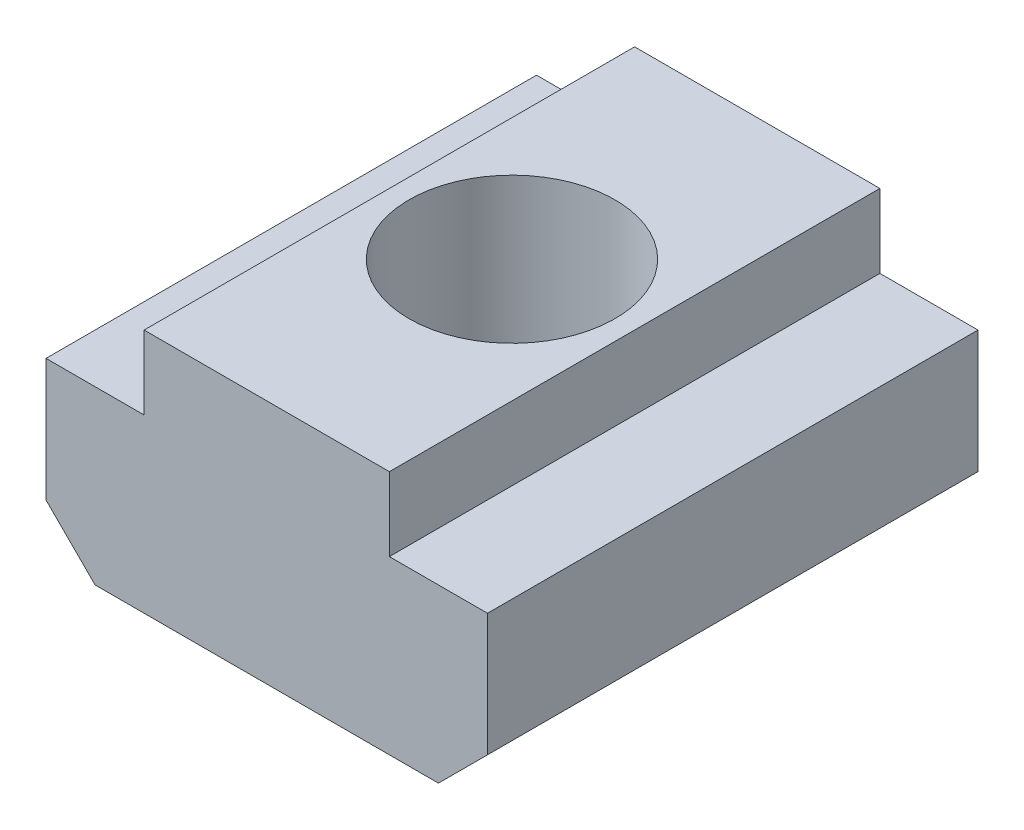
ISO-10303-21;
HEADER;
FILE_DESCRIPTION(('STEP AP214'),'2;1');
FILE_NAME('part.step','',(''),(''),'','','');
FILE_SCHEMA(('AUTOMOTIVE_DESIGN { 1 0 10303 214 1 1 1 1 }'));
ENDSEC;
DATA;
#1=APPLICATION_CONTEXT('core data for automotive mechanical design processes');
#2=APPLICATION_PROTOCOL_DEFINITION('international standard','automotive_design',2000,#1);
#3=PRODUCT_CONTEXT('',#1,'mechanical');
#4=PRODUCT('Part','Part','',(#3));
#5=PRODUCT_RELATED_PRODUCT_CATEGORY('part','',(#4));
#6=PRODUCT_DEFINITION_FORMATION('','',#4);
#7=PRODUCT_DEFINITION_CONTEXT('part definition',#1,'design');
#8=PRODUCT_DEFINITION('design','',#6,#7);
#9=PRODUCT_DEFINITION_SHAPE('','',#8);
#10=(LENGTH_UNIT() NAMED_UNIT(*) SI_UNIT(.MILLI.,.METRE.));
#11=(NAMED_UNIT(*) PLANE_ANGLE_UNIT() SI_UNIT($,.RADIAN.));
#12=(NAMED_UNIT(*) SI_UNIT($,.STERADIAN.) SOLID_ANGLE_UNIT());
#13=UNCERTAINTY_MEASURE_WITH_UNIT(LENGTH_MEASURE(1.E-05),#10,'distance_accuracy_value','');
#14=(GEOMETRIC_REPRESENTATION_CONTEXT(3) GLOBAL_UNCERTAINTY_ASSIGNED_CONTEXT((#13)) GLOBAL_UNIT_ASSIGNED_CONTEXT((#10,
#11,#12)) REPRESENTATION_CONTEXT('',''));
#15=CARTESIAN_POINT('',(0.,0.,0.));
#16=DIRECTION('',(0.,0.,1.));
#17=DIRECTION('',(1.,0.,0.));
#18=AXIS2_PLACEMENT_3D('',#15,#16,#17);
#19=CARTESIAN_POINT('',(-4.5,1.,10.));
#20=DIRECTION('',(0.707106781186548,0.707106781186548,0.));
#21=DIRECTION('',(-0.707106781186548,0.707106781186548,0.));
#22=AXIS2_PLACEMENT_3D('',#19,#20,#21);
#23=PLANE('',#22);
#24=DIRECTION('',(0.707106781186548,-0.707106781186548,0.));
#25=VECTOR('',#24,1.);
#26=CARTESIAN_POINT('',(-4.5,1.,0.));
#27=LINE('',#26,#25);
#28=CARTESIAN_POINT('',(-4.5,1.,0.));
#29=VERTEX_POINT('',#28);
#30=CARTESIAN_POINT('',(-3.5,0.,0.));
#31=VERTEX_POINT('',#30);
#32=EDGE_CURVE('E145',#29,#31,#27,.T.);
#33=ORIENTED_EDGE('',*,*,#32,.T.);
#34=DIRECTION('',(0.,0.,-1.));
#35=VECTOR('',#34,1.);
#36=CARTESIAN_POINT('',(-3.5,0.,10.));
#37=LINE('',#36,#35);
#38=CARTESIAN_POINT('',(-3.5,0.,10.));
#39=VERTEX_POINT('',#38);
#40=EDGE_CURVE('E11',#39,#31,#37,.T.);
#41=ORIENTED_EDGE('',*,*,#40,.F.);
#42=DIRECTION('',(0.707106781186548,-0.707106781186548,0.));
#43=VECTOR('',#42,1.);
#44=CARTESIAN_POINT('',(-4.5,1.,10.));
#45=LINE('',#44,#43);
#46=CARTESIAN_POINT('',(-4.5,1.,10.));
#47=VERTEX_POINT('',#46);
#48=EDGE_CURVE('E164',#47,#39,#45,.T.);
#49=ORIENTED_EDGE('',*,*,#48,.F.);
#50=DIRECTION('',(0.,0.,-1.));
#51=VECTOR('',#50,1.);
#52=CARTESIAN_POINT('',(-4.5,1.,10.));
#53=LINE('',#52,#51);
#54=EDGE_CURVE('E141',#47,#29,#53,.T.);
#55=ORIENTED_EDGE('',*,*,#54,.T.);
#56=EDGE_LOOP('',(#33,#41,#49,#55));
#57=FACE_BOUND('',#56,.T.);
#58=ADVANCED_FACE('F37',(#57),#23,.F.);
#59=CARTESIAN_POINT('',(-3.5,0.,10.));
#60=DIRECTION('',(0.,1.,0.));
#61=DIRECTION('',(0.,0.,1.));
#62=AXIS2_PLACEMENT_3D('',#59,#60,#61);
#63=PLANE('',#62);
#64=CARTESIAN_POINT('',(0.,0.,5.));
#65=DIRECTION('',(0.,1.,0.));
#66=DIRECTION('',(0.,0.,1.));
#67=AXIS2_PLACEMENT_3D('',#64,#65,#66);
#68=CIRCLE('',#67,2.1);
#69=CARTESIAN_POINT('',(0.,0.,7.1));
#70=VERTEX_POINT('',#69);
#71=EDGE_CURVE('E149',#70,#70,#68,.T.);
#72=ORIENTED_EDGE('',*,*,#71,.T.);
#73=EDGE_LOOP('',(#72));
#74=FACE_BOUND('',#73,.T.);
#75=DIRECTION('',(1.,0.,0.));
#76=VECTOR('',#75,1.);
#77=CARTESIAN_POINT('',(-3.5,0.,0.));
#78=LINE('',#77,#76);
#79=CARTESIAN_POINT('',(3.5,0.,0.));
#80=VERTEX_POINT('',#79);
#81=EDGE_CURVE('E148',#31,#80,#78,.T.);
#82=ORIENTED_EDGE('',*,*,#81,.T.);
#83=DIRECTION('',(0.,0.,-1.));
#84=VECTOR('',#83,1.);
#85=CARTESIAN_POINT('',(3.5,0.,10.));
#86=LINE('',#85,#84);
#87=CARTESIAN_POINT('',(3.5,0.,10.));
#88=VERTEX_POINT('',#87);
#89=EDGE_CURVE('E45',#88,#80,#86,.T.);
#90=ORIENTED_EDGE('',*,*,#89,.F.);
#91=DIRECTION('',(1.,0.,0.));
#92=VECTOR('',#91,1.);
#93=CARTESIAN_POINT('',(-3.5,0.,10.));
#94=LINE('',#93,#92);
#95=EDGE_CURVE('E102',#39,#88,#94,.T.);
#96=ORIENTED_EDGE('',*,*,#95,.F.);
#97=ORIENTED_EDGE('',*,*,#40,.T.);
#98=EDGE_LOOP('',(#82,#90,#96,#97));
#99=FACE_BOUND('',#98,.T.);
#100=ADVANCED_FACE('F240',(#74,#99),#63,.F.);
#101=CARTESIAN_POINT('',(3.5,0.,10.));
#102=DIRECTION('',(-0.707106781186547,0.707106781186548,0.));
#103=DIRECTION('',(-0.707106781186548,-0.707106781186547,0.));
#104=AXIS2_PLACEMENT_3D('',#101,#102,#103);
#105=PLANE('',#104);
#106=DIRECTION('',(0.707106781186548,0.707106781186547,0.));
#107=VECTOR('',#106,1.);
#108=CARTESIAN_POINT('',(3.5,0.,0.));
#109=LINE('',#108,#107);
#110=CARTESIAN_POINT('',(4.5,1.,0.));
#111=VERTEX_POINT('',#110);
#112=EDGE_CURVE('E151',#80,#111,#109,.T.);
#113=ORIENTED_EDGE('',*,*,#112,.T.);
#114=DIRECTION('',(0.,0.,-1.));
#115=VECTOR('',#114,1.);
#116=CARTESIAN_POINT('',(4.5,1.,10.));
#117=LINE('',#116,#115);
#118=CARTESIAN_POINT('',(4.5,1.,10.));
#119=VERTEX_POINT('',#118);
#120=EDGE_CURVE('E177',#119,#111,#117,.T.);
#121=ORIENTED_EDGE('',*,*,#120,.F.);
#122=DIRECTION('',(0.707106781186548,0.707106781186547,0.));
#123=VECTOR('',#122,1.);
#124=CARTESIAN_POINT('',(3.5,0.,10.));
#125=LINE('',#124,#123);
#126=EDGE_CURVE('E185',#88,#119,#125,.T.);
#127=ORIENTED_EDGE('',*,*,#126,.F.);
#128=ORIENTED_EDGE('',*,*,#89,.T.);
#129=EDGE_LOOP('',(#113,#121,#127,#128));
#130=FACE_BOUND('',#129,.T.);
#131=ADVANCED_FACE('F183',(#130),#105,.F.);
#132=CARTESIAN_POINT('',(4.5,1.,10.));
#133=DIRECTION('',(-1.,0.,0.));
#134=DIRECTION('',(0.,0.,1.));
#135=AXIS2_PLACEMENT_3D('',#132,#133,#134);
#136=PLANE('',#135);
#137=DIRECTION('',(0.,1.,0.));
#138=VECTOR('',#137,1.);
#139=CARTESIAN_POINT('',(4.5,1.,0.));
#140=LINE('',#139,#138);
#141=CARTESIAN_POINT('',(4.5,3.5,0.));
#142=VERTEX_POINT('',#141);
#143=EDGE_CURVE('E153',#111,#142,#140,.T.);
#144=ORIENTED_EDGE('',*,*,#143,.T.);
#145=DIRECTION('',(0.,0.,-1.));
#146=VECTOR('',#145,1.);
#147=CARTESIAN_POINT('',(4.5,3.5,10.));
#148=LINE('',#147,#146);
#149=CARTESIAN_POINT('',(4.5,3.5,10.));
#150=VERTEX_POINT('',#149);
#151=EDGE_CURVE('E174',#150,#142,#148,.T.);
#152=ORIENTED_EDGE('',*,*,#151,.F.);
#153=DIRECTION('',(0.,1.,0.));
#154=VECTOR('',#153,1.);
#155=CARTESIAN_POINT('',(4.5,1.,10.));
#156=LINE('',#155,#154);
#157=EDGE_CURVE('E203',#119,#150,#156,.T.);
#158=ORIENTED_EDGE('',*,*,#157,.F.);
#159=ORIENTED_EDGE('',*,*,#120,.T.);
#160=EDGE_LOOP('',(#144,#152,#158,#159));
#161=FACE_BOUND('',#160,.T.);
#162=ADVANCED_FACE('F194',(#161),#136,.F.);
#163=CARTESIAN_POINT('',(4.5,3.5,10.));
#164=DIRECTION('',(0.,-1.,0.));
#165=DIRECTION('',(1.,0.,0.));
#166=AXIS2_PLACEMENT_3D('',#163,#164,#165);
#167=PLANE('',#166);
#168=DIRECTION('',(-1.,0.,0.));
#169=VECTOR('',#168,1.);
#170=CARTESIAN_POINT('',(4.5,3.5,0.));
#171=LINE('',#170,#169);
#172=CARTESIAN_POINT('',(2.5,3.5,0.));
#173=VERTEX_POINT('',#172);
#174=EDGE_CURVE('E155',#142,#173,#171,.T.);
#175=ORIENTED_EDGE('',*,*,#174,.T.);
#176=DIRECTION('',(0.,0.,-1.));
#177=VECTOR('',#176,1.);
#178=CARTESIAN_POINT('',(2.5,3.5,10.));
#179=LINE('',#178,#177);
#180=CARTESIAN_POINT('',(2.5,3.5,10.));
#181=VERTEX_POINT('',#180);
#182=EDGE_CURVE('E171',#181,#173,#179,.T.);
#183=ORIENTED_EDGE('',*,*,#182,.F.);
#184=DIRECTION('',(-1.,0.,0.));
#185=VECTOR('',#184,1.);
#186=CARTESIAN_POINT('',(4.5,3.5,10.));
#187=LINE('',#186,#185);
#188=EDGE_CURVE('E200',#150,#181,#187,.T.);
#189=ORIENTED_EDGE('',*,*,#188,.F.);
#190=ORIENTED_EDGE('',*,*,#151,.T.);
#191=EDGE_LOOP('',(#175,#183,#189,#190));
#192=FACE_BOUND('',#191,.T.);
#193=ADVANCED_FACE('F198',(#192),#167,.F.);
#194=CARTESIAN_POINT('',(2.5,3.5,10.));
#195=DIRECTION('',(-1.,0.,0.));
#196=DIRECTION('',(0.,0.,1.));
#197=AXIS2_PLACEMENT_3D('',#194,#195,#196);
#198=PLANE('',#197);
#199=DIRECTION('',(0.,1.,0.));
#200=VECTOR('',#199,1.);
#201=CARTESIAN_POINT('',(2.5,3.5,0.));
#202=LINE('',#201,#200);
#203=CARTESIAN_POINT('',(2.5,5.,0.));
#204=VERTEX_POINT('',#203);
#205=EDGE_CURVE('E157',#173,#204,#202,.T.);
#206=ORIENTED_EDGE('',*,*,#205,.T.);
#207=DIRECTION('',(0.,0.,-1.));
#208=VECTOR('',#207,1.);
#209=CARTESIAN_POINT('',(2.5,5.,10.));
#210=LINE('',#209,#208);
#211=CARTESIAN_POINT('',(2.5,5.,10.));
#212=VERTEX_POINT('',#211);
#213=EDGE_CURVE('E168',#212,#204,#210,.T.);
#214=ORIENTED_EDGE('',*,*,#213,.F.);
#215=DIRECTION('',(0.,1.,0.));
#216=VECTOR('',#215,1.);
#217=CARTESIAN_POINT('',(2.5,3.5,10.));
#218=LINE('',#217,#216);
#219=EDGE_CURVE('E202',#181,#212,#218,.T.);
#220=ORIENTED_EDGE('',*,*,#219,.F.);
#221=ORIENTED_EDGE('',*,*,#182,.T.);
#222=EDGE_LOOP('',(#206,#214,#220,#221));
#223=FACE_BOUND('',#222,.T.);
#224=ADVANCED_FACE('F222',(#223),#198,.F.);
#225=CARTESIAN_POINT('',(2.5,5.,10.));
#226=DIRECTION('',(0.,-1.,0.));
#227=DIRECTION('',(0.,0.,-1.));
#228=AXIS2_PLACEMENT_3D('',#225,#226,#227);
#229=PLANE('',#228);
#230=CARTESIAN_POINT('',(0.,5.,5.));
#231=DIRECTION('',(0.,1.,0.));
#232=DIRECTION('',(0.,0.,1.));
#233=AXIS2_PLACEMENT_3D('',#230,#231,#232);
#234=CIRCLE('',#233,2.1);
#235=CARTESIAN_POINT('',(0.,5.,7.1));
#236=VERTEX_POINT('',#235);
#237=EDGE_CURVE('E213',#236,#236,#234,.T.);
#238=ORIENTED_EDGE('',*,*,#237,.F.);
#239=EDGE_LOOP('',(#238));
#240=FACE_BOUND('',#239,.T.);
#241=DIRECTION('',(-1.,0.,0.));
#242=VECTOR('',#241,1.);
#243=CARTESIAN_POINT('',(2.5,5.,0.));
#244=LINE('',#243,#242);
#245=CARTESIAN_POINT('',(-2.5,5.,0.));
#246=VERTEX_POINT('',#245);
#247=EDGE_CURVE('E159',#204,#246,#244,.T.);
#248=ORIENTED_EDGE('',*,*,#247,.T.);
#249=DIRECTION('',(0.,0.,-1.));
#250=VECTOR('',#249,1.);
#251=CARTESIAN_POINT('',(-2.5,5.,10.));
#252=LINE('',#251,#250);
#253=CARTESIAN_POINT('',(-2.5,5.,10.));
#254=VERTEX_POINT('',#253);
#255=EDGE_CURVE('E136',#254,#246,#252,.T.);
#256=ORIENTED_EDGE('',*,*,#255,.F.);
#257=DIRECTION('',(-1.,0.,0.));
#258=VECTOR('',#257,1.);
#259=CARTESIAN_POINT('',(2.5,5.,10.));
#260=LINE('',#259,#258);
#261=EDGE_CURVE('E127',#212,#254,#260,.T.);
#262=ORIENTED_EDGE('',*,*,#261,.F.);
#263=ORIENTED_EDGE('',*,*,#213,.T.);
#264=EDGE_LOOP('',(#248,#256,#262,#263));
#265=FACE_BOUND('',#264,.T.);
#266=ADVANCED_FACE('F219',(#240,#265),#229,.F.);
#267=CARTESIAN_POINT('',(-2.5,5.,10.));
#268=DIRECTION('',(1.,0.,0.));
#269=DIRECTION('',(0.,0.,-1.));
#270=AXIS2_PLACEMENT_3D('',#267,#268,#269);
#271=PLANE('',#270);
#272=DIRECTION('',(0.,-1.,0.));
#273=VECTOR('',#272,1.);
#274=CARTESIAN_POINT('',(-2.5,5.,0.));
#275=LINE('',#274,#273);
#276=CARTESIAN_POINT('',(-2.5,3.5,0.));
#277=VERTEX_POINT('',#276);
#278=EDGE_CURVE('E135',#246,#277,#275,.T.);
#279=ORIENTED_EDGE('',*,*,#278,.T.);
#280=DIRECTION('',(0.,0.,-1.));
#281=VECTOR('',#280,1.);
#282=CARTESIAN_POINT('',(-2.5,3.5,10.));
#283=LINE('',#282,#281);
#284=CARTESIAN_POINT('',(-2.5,3.5,10.));
#285=VERTEX_POINT('',#284);
#286=EDGE_CURVE('E132',#285,#277,#283,.T.);
#287=ORIENTED_EDGE('',*,*,#286,.F.);
#288=DIRECTION('',(0.,-1.,0.));
#289=VECTOR('',#288,1.);
#290=CARTESIAN_POINT('',(-2.5,5.,10.));
#291=LINE('',#290,#289);
#292=EDGE_CURVE('E121',#254,#285,#291,.T.);
#293=ORIENTED_EDGE('',*,*,#292,.F.);
#294=ORIENTED_EDGE('',*,*,#255,.T.);
#295=EDGE_LOOP('',(#279,#287,#293,#294));
#296=FACE_BOUND('',#295,.T.);
#297=ADVANCED_FACE('F133',(#296),#271,.F.);
#298=CARTESIAN_POINT('',(-2.5,3.5,10.));
#299=DIRECTION('',(0.,-1.,0.));
#300=DIRECTION('',(1.,0.,0.));
#301=AXIS2_PLACEMENT_3D('',#298,#299,#300);
#302=PLANE('',#301);
#303=DIRECTION('',(-1.,0.,0.));
#304=VECTOR('',#303,1.);
#305=CARTESIAN_POINT('',(-2.5,3.5,0.));
#306=LINE('',#305,#304);
#307=CARTESIAN_POINT('',(-4.5,3.5,0.));
#308=VERTEX_POINT('',#307);
#309=EDGE_CURVE('E88',#277,#308,#306,.T.);
#310=ORIENTED_EDGE('',*,*,#309,.T.);
#311=DIRECTION('',(0.,0.,-1.));
#312=VECTOR('',#311,1.);
#313=CARTESIAN_POINT('',(-4.5,3.5,10.));
#314=LINE('',#313,#312);
#315=CARTESIAN_POINT('',(-4.5,3.5,10.));
#316=VERTEX_POINT('',#315);
#317=EDGE_CURVE('E137',#316,#308,#314,.T.);
#318=ORIENTED_EDGE('',*,*,#317,.F.);
#319=DIRECTION('',(-1.,0.,0.));
#320=VECTOR('',#319,1.);
#321=CARTESIAN_POINT('',(-2.5,3.5,10.));
#322=LINE('',#321,#320);
#323=EDGE_CURVE('E125',#285,#316,#322,.T.);
#324=ORIENTED_EDGE('',*,*,#323,.F.);
#325=ORIENTED_EDGE('',*,*,#286,.T.);
#326=EDGE_LOOP('',(#310,#318,#324,#325));
#327=FACE_BOUND('',#326,.T.);
#328=ADVANCED_FACE('F139',(#327),#302,.F.);
#329=CARTESIAN_POINT('',(-4.5,3.5,10.));
#330=DIRECTION('',(1.,0.,0.));
#331=DIRECTION('',(0.,0.,-1.));
#332=AXIS2_PLACEMENT_3D('',#329,#330,#331);
#333=PLANE('',#332);
#334=DIRECTION('',(0.,-1.,0.));
#335=VECTOR('',#334,1.);
#336=CARTESIAN_POINT('',(-4.5,3.5,0.));
#337=LINE('',#336,#335);
#338=EDGE_CURVE('E94',#308,#29,#337,.T.);
#339=ORIENTED_EDGE('',*,*,#338,.T.);
#340=ORIENTED_EDGE('',*,*,#54,.F.);
#341=DIRECTION('',(0.,-1.,0.));
#342=VECTOR('',#341,1.);
#343=CARTESIAN_POINT('',(-4.5,3.5,10.));
#344=LINE('',#343,#342);
#345=EDGE_CURVE('E53',#316,#47,#344,.T.);
#346=ORIENTED_EDGE('',*,*,#345,.F.);
#347=ORIENTED_EDGE('',*,*,#317,.T.);
#348=EDGE_LOOP('',(#339,#340,#346,#347));
#349=FACE_BOUND('',#348,.T.);
#350=ADVANCED_FACE('F229',(#349),#333,.F.);
#351=CARTESIAN_POINT('',(0.,0.,10.));
#352=DIRECTION('',(0.,0.,1.));
#353=DIRECTION('',(1.,0.,0.));
#354=AXIS2_PLACEMENT_3D('',#351,#352,#353);
#355=PLANE('',#354);
#356=ORIENTED_EDGE('',*,*,#48,.T.);
#357=ORIENTED_EDGE('',*,*,#95,.T.);
#358=ORIENTED_EDGE('',*,*,#126,.T.);
#359=ORIENTED_EDGE('',*,*,#157,.T.);
#360=ORIENTED_EDGE('',*,*,#188,.T.);
#361=ORIENTED_EDGE('',*,*,#219,.T.);
#362=ORIENTED_EDGE('',*,*,#261,.T.);
#363=ORIENTED_EDGE('',*,*,#292,.T.);
#364=ORIENTED_EDGE('',*,*,#323,.T.);
#365=ORIENTED_EDGE('',*,*,#345,.T.);
#366=EDGE_LOOP('',(#356,#357,#358,#359,#360,#361,#362,#363,#364,#365));
#367=FACE_BOUND('',#366,.T.);
#368=ADVANCED_FACE('F123',(#367),#355,.T.);
#369=CARTESIAN_POINT('',(0.,0.,0.));
#370=DIRECTION('',(0.,0.,1.));
#371=DIRECTION('',(1.,0.,0.));
#372=AXIS2_PLACEMENT_3D('',#369,#370,#371);
#373=PLANE('',#372);
#374=ORIENTED_EDGE('',*,*,#32,.F.);
#375=ORIENTED_EDGE('',*,*,#338,.F.);
#376=ORIENTED_EDGE('',*,*,#309,.F.);
#377=ORIENTED_EDGE('',*,*,#278,.F.);
#378=ORIENTED_EDGE('',*,*,#247,.F.);
#379=ORIENTED_EDGE('',*,*,#205,.F.);
#380=ORIENTED_EDGE('',*,*,#174,.F.);
#381=ORIENTED_EDGE('',*,*,#143,.F.);
#382=ORIENTED_EDGE('',*,*,#112,.F.);
#383=ORIENTED_EDGE('',*,*,#81,.F.);
#384=EDGE_LOOP('',(#374,#375,#376,#377,#378,#379,#380,#381,#382,#383));
#385=FACE_BOUND('',#384,.T.);
#386=ADVANCED_FACE('F189',(#385),#373,.F.);
#387=CARTESIAN_POINT('',(0.,5.,5.));
#388=DIRECTION('',(0.,1.,0.));
#389=DIRECTION('',(0.,0.,1.));
#390=AXIS2_PLACEMENT_3D('',#387,#388,#389);
#391=CYLINDRICAL_SURFACE('',#390,2.1);
#392=ORIENTED_EDGE('',*,*,#71,.F.);
#393=EDGE_LOOP('',(#392));
#394=FACE_BOUND('',#393,.T.);
#395=ORIENTED_EDGE('',*,*,#237,.T.);
#396=EDGE_LOOP('',(#395));
#397=FACE_BOUND('',#396,.T.);
#398=ADVANCED_FACE('F217',(#394,#397),#391,.F.);
#399=CLOSED_SHELL('',(#58,#100,#131,#162,#193,#224,#266,#297,#328,#350,#368,#386,#398));
#400=MANIFOLD_SOLID_BREP('B2',#399);
#401=ADVANCED_BREP_SHAPE_REPRESENTATION('',(#18,#400),#14);
#402=SHAPE_DEFINITION_REPRESENTATION(#9,#401);
ENDSEC;
END-ISO-10303-21;
